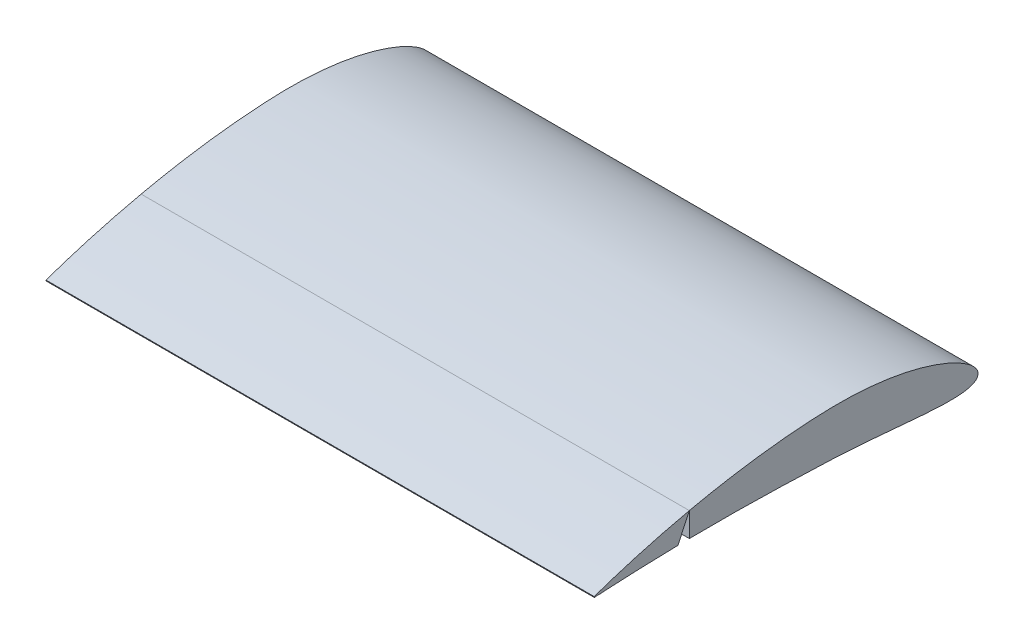
ISO-10303-21;
HEADER;
FILE_DESCRIPTION(('STEP AP214'),'2;1');
FILE_NAME('part.step','',(''),(''),'','','');
FILE_SCHEMA(('AUTOMOTIVE_DESIGN { 1 0 10303 214 1 1 1 1 }'));
ENDSEC;
DATA;
#1=APPLICATION_CONTEXT('core data for automotive mechanical design processes');
#2=APPLICATION_PROTOCOL_DEFINITION('international standard','automotive_design',2000,#1);
#3=PRODUCT_CONTEXT('',#1,'mechanical');
#4=PRODUCT('Part','Part','',(#3));
#5=PRODUCT_RELATED_PRODUCT_CATEGORY('part','',(#4));
#6=PRODUCT_DEFINITION_FORMATION('','',#4);
#7=PRODUCT_DEFINITION_CONTEXT('part definition',#1,'design');
#8=PRODUCT_DEFINITION('design','',#6,#7);
#9=PRODUCT_DEFINITION_SHAPE('','',#8);
#10=(LENGTH_UNIT() NAMED_UNIT(*) SI_UNIT(.MILLI.,.METRE.));
#11=(NAMED_UNIT(*) PLANE_ANGLE_UNIT() SI_UNIT($,.RADIAN.));
#12=(NAMED_UNIT(*) SI_UNIT($,.STERADIAN.) SOLID_ANGLE_UNIT());
#13=UNCERTAINTY_MEASURE_WITH_UNIT(LENGTH_MEASURE(1.E-05),#10,'distance_accuracy_value','');
#14=(GEOMETRIC_REPRESENTATION_CONTEXT(3) GLOBAL_UNCERTAINTY_ASSIGNED_CONTEXT((#13)) GLOBAL_UNIT_ASSIGNED_CONTEXT((#10,
#11,#12)) REPRESENTATION_CONTEXT('',''));
#15=CARTESIAN_POINT('',(0.,0.,0.));
#16=DIRECTION('',(0.,0.,1.));
#17=DIRECTION('',(1.,0.,0.));
#18=AXIS2_PLACEMENT_3D('',#15,#16,#17);
#19=CARTESIAN_POINT('',(-254.,-0.0302571964763549,354.787327227915));
#20=CARTESIAN_POINT('',(-254.,-0.202511549774369,354.777220058735));
#21=CARTESIAN_POINT('',(-254.,-0.758116619532224,354.744619463571));
#22=CARTESIAN_POINT('',(-254.,-0.0353878265544988,352.780150329408));
#23=CARTESIAN_POINT('',(-254.,-0.406394891328532,350.227621537646));
#24=CARTESIAN_POINT('',(-254.,0.191518705423128,345.076973542852));
#25=CARTESIAN_POINT('',(-254.,0.426846954997304,338.388880463138));
#26=CARTESIAN_POINT('',(-254.,0.912902226587254,329.767358245601));
#27=CARTESIAN_POINT('',(-254.,1.37107480853054,319.513378005819));
#28=CARTESIAN_POINT('',(-254.,1.85212662662604,307.681856469284));
#29=CARTESIAN_POINT('',(-254.,2.2828903737653,294.437996631764));
#30=CARTESIAN_POINT('',(-254.,2.65636592644588,279.933149694368));
#31=CARTESIAN_POINT('',(-254.,2.90744759821903,264.337268620967));
#32=CARTESIAN_POINT('',(-254.,3.02848065946825,247.830237404837));
#33=CARTESIAN_POINT('',(-254.,2.97910623211237,224.541124113717));
#34=CARTESIAN_POINT('',(-254.,2.58624656268472,200.671973719441));
#35=CARTESIAN_POINT('',(-254.,1.91789319340299,176.483884619505));
#36=CARTESIAN_POINT('',(-254.,1.28674404323604,158.296467958687));
#37=CARTESIAN_POINT('',(-254.,0.674535202653767,140.48477689744));
#38=CARTESIAN_POINT('',(-254.,-0.458414507964394,117.937239158073));
#39=CARTESIAN_POINT('',(-254.,-2.15355585803942,96.4067365521407));
#40=CARTESIAN_POINT('',(-254.,-3.98391169785236,75.9298626432168));
#41=CARTESIAN_POINT('',(-254.,-5.23803481691952,61.9523939500743));
#42=CARTESIAN_POINT('',(-254.,-6.3018667845873,49.0830780174977));
#43=CARTESIAN_POINT('',(-254.,-7.05379709208437,37.4470572233417));
#44=CARTESIAN_POINT('',(-254.,-7.40487495085787,27.1638266260831));
#45=CARTESIAN_POINT('',(-254.,-7.26852765592077,18.3491197902741));
#46=CARTESIAN_POINT('',(-254.,-6.58746462442697,11.0873159681167));
#47=CARTESIAN_POINT('',(-254.,-5.28808573883758,5.4507808849597));
#48=CARTESIAN_POINT('',(-254.,-3.30894318563573,1.35108725963543));
#49=CARTESIAN_POINT('',(-254.,-0.148325215865237,-0.987487677240321));
#50=CARTESIAN_POINT('',(-254.,3.7967578133831,-0.765838064798878));
#51=CARTESIAN_POINT('',(-254.,7.71649979382027,1.67922407257184));
#52=CARTESIAN_POINT('',(-254.,11.8553419578337,5.92689766090299));
#53=CARTESIAN_POINT('',(-254.,16.2262899348965,12.1072031542234));
#54=CARTESIAN_POINT('',(-254.,20.7343193498453,20.187014187513));
#55=CARTESIAN_POINT('',(-254.,25.2201252971746,30.130463623116));
#56=CARTESIAN_POINT('',(-254.,29.5108543834638,41.8433907768923));
#57=CARTESIAN_POINT('',(-254.,33.4329059974258,55.1997604360673));
#58=CARTESIAN_POINT('',(-254.,36.8104805743368,70.0434509571498));
#59=CARTESIAN_POINT('',(-254.,39.4786761807971,86.1884085277303));
#60=CARTESIAN_POINT('',(-254.,41.32105063238,103.42216726238));
#61=CARTESIAN_POINT('',(-254.,42.2288581946823,121.516747473044));
#62=CARTESIAN_POINT('',(-254.,42.1113766684293,140.09669102153));
#63=CARTESIAN_POINT('',(-254.,41.1132128906756,158.902335219002));
#64=CARTESIAN_POINT('',(-254.,39.0904540579609,183.961657870227));
#65=CARTESIAN_POINT('',(-254.,36.0047557168601,208.774809212926));
#66=CARTESIAN_POINT('',(-254.,31.1455287976255,238.622276389231));
#67=CARTESIAN_POINT('',(-254.,26.6515697314507,261.175777938493));
#68=CARTESIAN_POINT('',(-254.,21.7242725259394,282.422876263721));
#69=CARTESIAN_POINT('',(-254.,17.1306006385399,300.598349456261));
#70=CARTESIAN_POINT('',(-254.,11.7988919274353,319.654473711953));
#71=CARTESIAN_POINT('',(-254.,6.72155114802005,336.024074691811));
#72=CARTESIAN_POINT('',(-254.,3.49779827393597,345.800950265157));
#73=CARTESIAN_POINT('',(-254.,1.92709586834348,350.478726649503));
#74=CARTESIAN_POINT('',(-254.,0.953557869568799,353.29965963041));
#75=CARTESIAN_POINT('',(-254.,0.519388000117919,354.559877308969));
#76=CARTESIAN_POINT('',(-254.,0.410417886541196,354.876173010782));
#77=B_SPLINE_CURVE_WITH_KNOTS('',3,(#19,#20,#21,#22,#23,#24,#25,#26,#27,#28,#29,#30,#31,#32,#33,
#34,#35,#36,#37,#38,#39,#40,#41,#42,#43,#44,#45,#46,#47,#48,#49,#50,#51,#52,#53,#54,#55,#56,#57,
#58,#59,#60,#61,#62,#63,#64,#65,#66,#67,#68,#69,#70,#71,#72,#73,#74,#75,#76),.UNSPECIFIED.,.F.,
.F.,(4,1,1,1,1,1,1,1,1,1,1,1,1,1,1,1,1,1,1,1,1,1,1,1,1,1,1,1,1,1,1,1,1,1,1,1,1,1,1,1,1,1,1,1,1,
1,1,1,1,1,1,1,1,1,1,4),(0.,0.00061435602735338,0.00198160056276364,0.00606849911990259,
0.0128259983002053,0.0221600600259541,0.0339528411484215,0.0480573219049674,0.0643016527838605,
0.0824806064748046,0.102390013464696,0.123786894847983,0.146429707819126,0.170067604158041,
0.219268231220122,0.244299756437978,0.269272617042279,0.293879334559277,0.317367886846568,
0.361825599196296,0.382415541627446,0.401655123624231,0.419361860817184,0.435356743556399,
0.44945739068769,0.461534248286615,0.471483960270294,0.479298491667603,0.485175806315722,
0.489815015537041,0.49445371882196,0.500384211459872,0.508369297965653,0.518670584727767,
0.531320006060474,0.54625561026072,0.563345994084458,0.58242326585592,0.60328874622392,
0.625720296766354,0.649474912467889,0.674310012117921,0.699958821683972,0.725614899189679,
0.751503233324799,0.803021620411888,0.828087427427487,0.875472920842336,0.897280851310736,
0.917503738861992,0.952328750245583,0.978398030734231,0.987765198149775,0.994535224157492,
0.998628423374974,1.),.UNSPECIFIED.);
#78=DIRECTION('',(1.,0.,0.));
#79=VECTOR('',#78,1.);
#80=SURFACE_OF_LINEAR_EXTRUSION('',#77,#79);
#81=DIRECTION('',(1.,0.,0.));
#82=VECTOR('',#81,1.);
#83=CARTESIAN_POINT('',(-254.,2.68576626150921,277.250314183645));
#84=LINE('',#83,#82);
#85=CARTESIAN_POINT('',(-254.,2.6857662610756,277.250314183847));
#86=VERTEX_POINT('',#85);
#87=CARTESIAN_POINT('',(254.,2.68576626107558,277.250314183847));
#88=VERTEX_POINT('',#87);
#89=EDGE_CURVE('E68',#86,#88,#84,.T.);
#90=ORIENTED_EDGE('',*,*,#89,.T.);
#91=CARTESIAN_POINT('',(254.,-0.0302571964763549,354.787327227915));
#92=CARTESIAN_POINT('',(254.,-0.202511549774369,354.777220058735));
#93=CARTESIAN_POINT('',(254.,-0.758116619532224,354.744619463571));
#94=CARTESIAN_POINT('',(254.,-0.0353878265544988,352.780150329408));
#95=CARTESIAN_POINT('',(254.,-0.406394891328532,350.227621537646));
#96=CARTESIAN_POINT('',(254.,0.191518705423128,345.076973542852));
#97=CARTESIAN_POINT('',(254.,0.426846954997304,338.388880463138));
#98=CARTESIAN_POINT('',(254.,0.912902226587254,329.767358245601));
#99=CARTESIAN_POINT('',(254.,1.37107480853054,319.513378005819));
#100=CARTESIAN_POINT('',(254.,1.85212662662604,307.681856469284));
#101=CARTESIAN_POINT('',(254.,2.2828903737653,294.437996631764));
#102=CARTESIAN_POINT('',(254.,2.65636592644588,279.933149694368));
#103=CARTESIAN_POINT('',(254.,2.90744759821903,264.337268620967));
#104=CARTESIAN_POINT('',(254.,3.02848065946825,247.830237404837));
#105=CARTESIAN_POINT('',(254.,2.97910623211237,224.541124113717));
#106=CARTESIAN_POINT('',(254.,2.58624656268472,200.671973719441));
#107=CARTESIAN_POINT('',(254.,1.91789319340299,176.483884619505));
#108=CARTESIAN_POINT('',(254.,1.28674404323604,158.296467958687));
#109=CARTESIAN_POINT('',(254.,0.674535202653767,140.48477689744));
#110=CARTESIAN_POINT('',(254.,-0.458414507964394,117.937239158073));
#111=CARTESIAN_POINT('',(254.,-2.15355585803942,96.4067365521407));
#112=CARTESIAN_POINT('',(254.,-3.98391169785236,75.9298626432168));
#113=CARTESIAN_POINT('',(254.,-5.23803481691952,61.9523939500743));
#114=CARTESIAN_POINT('',(254.,-6.3018667845873,49.0830780174977));
#115=CARTESIAN_POINT('',(254.,-7.05379709208437,37.4470572233417));
#116=CARTESIAN_POINT('',(254.,-7.40487495085787,27.1638266260831));
#117=CARTESIAN_POINT('',(254.,-7.26852765592077,18.3491197902741));
#118=CARTESIAN_POINT('',(254.,-6.58746462442697,11.0873159681167));
#119=CARTESIAN_POINT('',(254.,-5.28808573883758,5.4507808849597));
#120=CARTESIAN_POINT('',(254.,-3.30894318563573,1.35108725963543));
#121=CARTESIAN_POINT('',(254.,-0.148325215865237,-0.987487677240321));
#122=CARTESIAN_POINT('',(254.,3.7967578133831,-0.765838064798878));
#123=CARTESIAN_POINT('',(254.,7.71649979382027,1.67922407257184));
#124=CARTESIAN_POINT('',(254.,11.8553419578337,5.92689766090299));
#125=CARTESIAN_POINT('',(254.,16.2262899348965,12.1072031542234));
#126=CARTESIAN_POINT('',(254.,20.7343193498453,20.187014187513));
#127=CARTESIAN_POINT('',(254.,25.2201252971746,30.130463623116));
#128=CARTESIAN_POINT('',(254.,29.5108543834638,41.8433907768923));
#129=CARTESIAN_POINT('',(254.,33.4329059974258,55.1997604360673));
#130=CARTESIAN_POINT('',(254.,36.8104805743368,70.0434509571498));
#131=CARTESIAN_POINT('',(254.,39.4786761807971,86.1884085277303));
#132=CARTESIAN_POINT('',(254.,41.32105063238,103.42216726238));
#133=CARTESIAN_POINT('',(254.,42.2288581946823,121.516747473044));
#134=CARTESIAN_POINT('',(254.,42.1113766684293,140.09669102153));
#135=CARTESIAN_POINT('',(254.,41.1132128906756,158.902335219002));
#136=CARTESIAN_POINT('',(254.,39.0904540579609,183.961657870227));
#137=CARTESIAN_POINT('',(254.,36.0047557168601,208.774809212926));
#138=CARTESIAN_POINT('',(254.,31.1455287976255,238.622276389231));
#139=CARTESIAN_POINT('',(254.,26.6515697314507,261.175777938493));
#140=CARTESIAN_POINT('',(254.,21.7242725259394,282.422876263721));
#141=CARTESIAN_POINT('',(254.,17.1306006385399,300.598349456261));
#142=CARTESIAN_POINT('',(254.,11.7988919274353,319.654473711953));
#143=CARTESIAN_POINT('',(254.,6.72155114802005,336.024074691811));
#144=CARTESIAN_POINT('',(254.,3.49779827393597,345.800950265157));
#145=CARTESIAN_POINT('',(254.,1.92709586834348,350.478726649503));
#146=CARTESIAN_POINT('',(254.,0.953557869568799,353.29965963041));
#147=CARTESIAN_POINT('',(254.,0.519388000117919,354.559877308969));
#148=CARTESIAN_POINT('',(254.,0.410417886541196,354.876173010782));
#149=B_SPLINE_CURVE_WITH_KNOTS('',3,(#91,#92,#93,#94,#95,#96,#97,#98,#99,#100,#101,#102,#103,
#104,#105,#106,#107,#108,#109,#110,#111,#112,#113,#114,#115,#116,#117,#118,#119,#120,#121,#122,
#123,#124,#125,#126,#127,#128,#129,#130,#131,#132,#133,#134,#135,#136,#137,#138,#139,#140,#141,
#142,#143,#144,#145,#146,#147,#148),.UNSPECIFIED.,.F.,.F.,(4,1,1,1,1,1,1,1,1,1,1,1,1,1,1,1,1,1,
1,1,1,1,1,1,1,1,1,1,1,1,1,1,1,1,1,1,1,1,1,1,1,1,1,1,1,1,1,1,1,1,1,1,1,1,1,4),(0.,
0.00061435602735338,0.00198160056276364,0.00606849911990259,0.0128259983002053,
0.0221600600259541,0.0339528411484215,0.0480573219049674,0.0643016527838605,0.0824806064748046,
0.102390013464696,0.123786894847983,0.146429707819126,0.170067604158041,0.219268231220122,
0.244299756437978,0.269272617042279,0.293879334559277,0.317367886846568,0.361825599196296,
0.382415541627446,0.401655123624231,0.419361860817184,0.435356743556399,0.44945739068769,
0.461534248286615,0.471483960270294,0.479298491667603,0.485175806315722,0.489815015537041,
0.49445371882196,0.500384211459872,0.508369297965653,0.518670584727767,0.531320006060474,
0.54625561026072,0.563345994084458,0.58242326585592,0.60328874622392,0.625720296766354,
0.649474912467889,0.674310012117921,0.699958821683972,0.725614899189679,0.751503233324799,
0.803021620411888,0.828087427427487,0.875472920842336,0.897280851310736,0.917503738861992,
0.952328750245583,0.978398030734231,0.987765198149775,0.994535224157492,0.998628423374974,1.),.UNSPECIFIED.);
#150=CARTESIAN_POINT('',(254.,-0.030257196476355,354.787327227915));
#151=VERTEX_POINT('',#150);
#152=EDGE_CURVE('E54',#151,#88,#149,.T.);
#153=ORIENTED_EDGE('',*,*,#152,.F.);
#154=DIRECTION('',(1.,0.,0.));
#155=VECTOR('',#154,1.);
#156=CARTESIAN_POINT('',(-254.,-0.030257196476355,354.787327227915));
#157=LINE('',#156,#155);
#158=CARTESIAN_POINT('',(-254.,-0.030257196476355,354.787327227915));
#159=VERTEX_POINT('',#158);
#160=EDGE_CURVE('E121',#159,#151,#157,.T.);
#161=ORIENTED_EDGE('',*,*,#160,.F.);
#162=EDGE_CURVE('E103',#159,#86,#77,.T.);
#163=ORIENTED_EDGE('',*,*,#162,.T.);
#164=EDGE_LOOP('',(#90,#153,#161,#163));
#165=FACE_BOUND('',#164,.T.);
#166=ADVANCED_FACE('F50',(#165),#80,.T.);
#167=CARTESIAN_POINT('',(254.,25.3109880456868,266.699999982787));
#168=VERTEX_POINT('',#167);
#169=CARTESIAN_POINT('',(254.,0.410417886541196,354.876173010782));
#170=VERTEX_POINT('',#169);
#171=EDGE_CURVE('E101',#168,#170,#149,.T.);
#172=ORIENTED_EDGE('',*,*,#171,.F.);
#173=DIRECTION('',(-1.,0.,0.));
#174=VECTOR('',#173,1.);
#175=CARTESIAN_POINT('',(254.001,25.3109880418854,266.7));
#176=LINE('',#175,#174);
#177=CARTESIAN_POINT('',(-254.,25.3109880418854,266.7));
#178=VERTEX_POINT('',#177);
#179=EDGE_CURVE('E87',#168,#178,#176,.T.);
#180=ORIENTED_EDGE('',*,*,#179,.T.);
#181=CARTESIAN_POINT('',(-254.,0.410417886541196,354.876173010782));
#182=VERTEX_POINT('',#181);
#183=EDGE_CURVE('E99',#178,#182,#77,.T.);
#184=ORIENTED_EDGE('',*,*,#183,.T.);
#185=DIRECTION('',(1.,0.,0.));
#186=VECTOR('',#185,1.);
#187=CARTESIAN_POINT('',(-254.,0.410417886541196,354.876173010782));
#188=LINE('',#187,#186);
#189=EDGE_CURVE('E108',#182,#170,#188,.T.);
#190=ORIENTED_EDGE('',*,*,#189,.T.);
#191=EDGE_LOOP('',(#172,#180,#184,#190));
#192=FACE_BOUND('',#191,.T.);
#193=ADVANCED_FACE('F97',(#192),#80,.T.);
#194=CARTESIAN_POINT('',(-254.,6.95548452892668,1.34686834904547));
#195=DIRECTION('',(-1.,0.,0.));
#196=DIRECTION('',(0.,0.,1.));
#197=AXIS2_PLACEMENT_3D('',#194,#195,#196);
#198=PLANE('',#197);
#199=DIRECTION('',(0.,0.906307787036649,-0.422618261740701));
#200=VECTOR('',#199,1.);
#201=CARTESIAN_POINT('',(-254.,25.3109880418854,266.7));
#202=LINE('',#201,#200);
#203=EDGE_CURVE('E61',#86,#178,#202,.T.);
#204=ORIENTED_EDGE('',*,*,#203,.F.);
#205=ORIENTED_EDGE('',*,*,#162,.F.);
#206=DIRECTION('',(0.,-0.980275441523261,-0.197636177726589));
#207=VECTOR('',#206,1.);
#208=CARTESIAN_POINT('',(-254.,-0.030257196476355,354.787327227915));
#209=LINE('',#208,#207);
#210=EDGE_CURVE('E94',#182,#159,#209,.T.);
#211=ORIENTED_EDGE('',*,*,#210,.F.);
#212=ORIENTED_EDGE('',*,*,#183,.F.);
#213=EDGE_LOOP('',(#204,#205,#211,#212));
#214=FACE_BOUND('',#213,.T.);
#215=ADVANCED_FACE('F106',(#214),#198,.T.);
#216=CARTESIAN_POINT('',(254.,6.95548452892668,1.34686834904547));
#217=DIRECTION('',(-1.,0.,0.));
#218=DIRECTION('',(0.,0.,1.));
#219=AXIS2_PLACEMENT_3D('',#216,#217,#218);
#220=PLANE('',#219);
#221=ORIENTED_EDGE('',*,*,#152,.T.);
#222=DIRECTION('',(0.,-0.906307787036649,0.422618261740702));
#223=VECTOR('',#222,1.);
#224=CARTESIAN_POINT('',(254.,25.3109880418854,266.7));
#225=LINE('',#224,#223);
#226=EDGE_CURVE('E12',#168,#88,#225,.T.);
#227=ORIENTED_EDGE('',*,*,#226,.F.);
#228=ORIENTED_EDGE('',*,*,#171,.T.);
#229=DIRECTION('',(0.,-0.980275441523261,-0.197636177726589));
#230=VECTOR('',#229,1.);
#231=CARTESIAN_POINT('',(254.,-0.030257196476355,354.787327227915));
#232=LINE('',#231,#230);
#233=EDGE_CURVE('E118',#170,#151,#232,.T.);
#234=ORIENTED_EDGE('',*,*,#233,.T.);
#235=EDGE_LOOP('',(#221,#227,#228,#234));
#236=FACE_BOUND('',#235,.T.);
#237=ADVANCED_FACE('F127',(#236),#220,.F.);
#238=CARTESIAN_POINT('',(-254.,-0.030257196476355,354.787327227915));
#239=DIRECTION('',(0.,-0.197636177726589,0.980275441523261));
#240=DIRECTION('',(0.,-0.980275441523261,-0.197636177726589));
#241=AXIS2_PLACEMENT_3D('',#238,#239,#240);
#242=PLANE('',#241);
#243=ORIENTED_EDGE('',*,*,#160,.T.);
#244=ORIENTED_EDGE('',*,*,#233,.F.);
#245=ORIENTED_EDGE('',*,*,#189,.F.);
#246=ORIENTED_EDGE('',*,*,#210,.T.);
#247=EDGE_LOOP('',(#243,#244,#245,#246));
#248=FACE_BOUND('',#247,.T.);
#249=ADVANCED_FACE('F125',(#248),#242,.T.);
#250=CARTESIAN_POINT('',(254.001,25.3109880418854,266.7));
#251=DIRECTION('',(0.,0.422618261740701,0.906307787036649));
#252=DIRECTION('',(0.,-0.906307787036649,0.422618261740702));
#253=AXIS2_PLACEMENT_3D('',#250,#251,#252);
#254=PLANE('',#253);
#255=ORIENTED_EDGE('',*,*,#203,.T.);
#256=ORIENTED_EDGE('',*,*,#179,.F.);
#257=ORIENTED_EDGE('',*,*,#226,.T.);
#258=ORIENTED_EDGE('',*,*,#89,.F.);
#259=EDGE_LOOP('',(#255,#256,#257,#258));
#260=FACE_BOUND('',#259,.T.);
#261=ADVANCED_FACE('F89',(#260),#254,.F.);
#262=CLOSED_SHELL('',(#166,#193,#215,#237,#249,#261));
#263=MANIFOLD_SOLID_BREP('B2',#262);
#264=CARTESIAN_POINT('',(254.,6.95548452892668,1.34686834904547));
#265=DIRECTION('',(-1.,0.,0.));
#266=DIRECTION('',(0.,0.,1.));
#267=AXIS2_PLACEMENT_3D('',#264,#265,#266);
#268=PLANE('',#267);
#269=CARTESIAN_POINT('',(254.,-0.0302571964763549,354.787327227915));
#270=CARTESIAN_POINT('',(254.,-0.202511549774369,354.777220058735));
#271=CARTESIAN_POINT('',(254.,-0.758116619532224,354.744619463571));
#272=CARTESIAN_POINT('',(254.,-0.0353878265544988,352.780150329408));
#273=CARTESIAN_POINT('',(254.,-0.406394891328532,350.227621537646));
#274=CARTESIAN_POINT('',(254.,0.191518705423128,345.076973542852));
#275=CARTESIAN_POINT('',(254.,0.426846954997304,338.388880463138));
#276=CARTESIAN_POINT('',(254.,0.912902226587254,329.767358245601));
#277=CARTESIAN_POINT('',(254.,1.37107480853054,319.513378005819));
#278=CARTESIAN_POINT('',(254.,1.85212662662604,307.681856469284));
#279=CARTESIAN_POINT('',(254.,2.2828903737653,294.437996631764));
#280=CARTESIAN_POINT('',(254.,2.65636592644588,279.933149694368));
#281=CARTESIAN_POINT('',(254.,2.90744759821903,264.337268620967));
#282=CARTESIAN_POINT('',(254.,3.02848065946825,247.830237404837));
#283=CARTESIAN_POINT('',(254.,2.97910623211237,224.541124113717));
#284=CARTESIAN_POINT('',(254.,2.58624656268472,200.671973719441));
#285=CARTESIAN_POINT('',(254.,1.91789319340299,176.483884619505));
#286=CARTESIAN_POINT('',(254.,1.28674404323604,158.296467958687));
#287=CARTESIAN_POINT('',(254.,0.674535202653767,140.48477689744));
#288=CARTESIAN_POINT('',(254.,-0.458414507964394,117.937239158073));
#289=CARTESIAN_POINT('',(254.,-2.15355585803942,96.4067365521407));
#290=CARTESIAN_POINT('',(254.,-3.98391169785236,75.9298626432168));
#291=CARTESIAN_POINT('',(254.,-5.23803481691952,61.9523939500743));
#292=CARTESIAN_POINT('',(254.,-6.3018667845873,49.0830780174977));
#293=CARTESIAN_POINT('',(254.,-7.05379709208437,37.4470572233417));
#294=CARTESIAN_POINT('',(254.,-7.40487495085787,27.1638266260831));
#295=CARTESIAN_POINT('',(254.,-7.26852765592077,18.3491197902741));
#296=CARTESIAN_POINT('',(254.,-6.58746462442697,11.0873159681167));
#297=CARTESIAN_POINT('',(254.,-5.28808573883758,5.4507808849597));
#298=CARTESIAN_POINT('',(254.,-3.30894318563573,1.35108725963543));
#299=CARTESIAN_POINT('',(254.,-0.148325215865237,-0.987487677240321));
#300=CARTESIAN_POINT('',(254.,3.7967578133831,-0.765838064798878));
#301=CARTESIAN_POINT('',(254.,7.71649979382027,1.67922407257184));
#302=CARTESIAN_POINT('',(254.,11.8553419578337,5.92689766090299));
#303=CARTESIAN_POINT('',(254.,16.2262899348965,12.1072031542234));
#304=CARTESIAN_POINT('',(254.,20.7343193498453,20.187014187513));
#305=CARTESIAN_POINT('',(254.,25.2201252971746,30.130463623116));
#306=CARTESIAN_POINT('',(254.,29.5108543834638,41.8433907768923));
#307=CARTESIAN_POINT('',(254.,33.4329059974258,55.1997604360673));
#308=CARTESIAN_POINT('',(254.,36.8104805743368,70.0434509571498));
#309=CARTESIAN_POINT('',(254.,39.4786761807971,86.1884085277303));
#310=CARTESIAN_POINT('',(254.,41.32105063238,103.42216726238));
#311=CARTESIAN_POINT('',(254.,42.2288581946823,121.516747473044));
#312=CARTESIAN_POINT('',(254.,42.1113766684293,140.09669102153));
#313=CARTESIAN_POINT('',(254.,41.1132128906756,158.902335219002));
#314=CARTESIAN_POINT('',(254.,39.0904540579609,183.961657870227));
#315=CARTESIAN_POINT('',(254.,36.0047557168601,208.774809212926));
#316=CARTESIAN_POINT('',(254.,31.1455287976255,238.622276389231));
#317=CARTESIAN_POINT('',(254.,26.6515697314507,261.175777938493));
#318=CARTESIAN_POINT('',(254.,21.7242725259394,282.422876263721));
#319=CARTESIAN_POINT('',(254.,17.1306006385399,300.598349456261));
#320=CARTESIAN_POINT('',(254.,11.7988919274353,319.654473711953));
#321=CARTESIAN_POINT('',(254.,6.72155114802005,336.024074691811));
#322=CARTESIAN_POINT('',(254.,3.49779827393597,345.800950265157));
#323=CARTESIAN_POINT('',(254.,1.92709586834348,350.478726649503));
#324=CARTESIAN_POINT('',(254.,0.953557869568799,353.29965963041));
#325=CARTESIAN_POINT('',(254.,0.519388000117919,354.559877308969));
#326=CARTESIAN_POINT('',(254.,0.410417886541196,354.876173010782));
#327=B_SPLINE_CURVE_WITH_KNOTS('',3,(#269,#270,#271,#272,#273,#274,#275,#276,#277,#278,#279,
#280,#281,#282,#283,#284,#285,#286,#287,#288,#289,#290,#291,#292,#293,#294,#295,#296,#297,#298,
#299,#300,#301,#302,#303,#304,#305,#306,#307,#308,#309,#310,#311,#312,#313,#314,#315,#316,#317,
#318,#319,#320,#321,#322,#323,#324,#325,#326),.UNSPECIFIED.,.F.,.F.,(4,1,1,1,1,1,1,1,1,1,1,1,1,
1,1,1,1,1,1,1,1,1,1,1,1,1,1,1,1,1,1,1,1,1,1,1,1,1,1,1,1,1,1,1,1,1,1,1,1,1,1,1,1,1,1,4),(0.,
0.00061435602735338,0.00198160056276364,0.00606849911990259,0.0128259983002053,
0.0221600600259541,0.0339528411484215,0.0480573219049674,0.0643016527838605,0.0824806064748046,
0.102390013464696,0.123786894847983,0.146429707819126,0.170067604158041,0.219268231220122,
0.244299756437978,0.269272617042279,0.293879334559277,0.317367886846568,0.361825599196296,
0.382415541627446,0.401655123624231,0.419361860817184,0.435356743556399,0.44945739068769,
0.461534248286615,0.471483960270294,0.479298491667603,0.485175806315722,0.489815015537041,
0.49445371882196,0.500384211459872,0.508369297965653,0.518670584727767,0.531320006060474,
0.54625561026072,0.563345994084458,0.58242326585592,0.60328874622392,0.625720296766354,
0.649474912467889,0.674310012117921,0.699958821683972,0.725614899189679,0.751503233324799,
0.803021620411888,0.828087427427487,0.875472920842336,0.897280851310736,0.917503738861992,
0.952328750245583,0.978398030734231,0.987765198149775,0.994535224157492,0.998628423374974,1.),.UNSPECIFIED.);
#328=CARTESIAN_POINT('',(254.,2.85478886450617,266.699999999999));
#329=VERTEX_POINT('',#328);
#330=CARTESIAN_POINT('',(254.,25.3109880418854,266.7));
#331=VERTEX_POINT('',#330);
#332=EDGE_CURVE('E220',#329,#331,#327,.T.);
#333=ORIENTED_EDGE('',*,*,#332,.T.);
#334=DIRECTION('',(0.,1.,0.));
#335=VECTOR('',#334,1.);
#336=CARTESIAN_POINT('',(254.,25.3109880418854,266.7));
#337=LINE('',#336,#335);
#338=EDGE_CURVE('E215',#329,#331,#337,.T.);
#339=ORIENTED_EDGE('',*,*,#338,.F.);
#340=EDGE_LOOP('',(#333,#339));
#341=FACE_BOUND('',#340,.T.);
#342=ADVANCED_FACE('F185',(#341),#268,.F.);
#343=CARTESIAN_POINT('',(-254.,6.95548452892668,1.34686834904547));
#344=DIRECTION('',(-1.,0.,0.));
#345=DIRECTION('',(0.,0.,1.));
#346=AXIS2_PLACEMENT_3D('',#343,#344,#345);
#347=PLANE('',#346);
#348=DIRECTION('',(0.,-1.,0.));
#349=VECTOR('',#348,1.);
#350=CARTESIAN_POINT('',(-254.,25.3109880418854,266.7));
#351=LINE('',#350,#349);
#352=CARTESIAN_POINT('',(-254.,25.3109880418854,266.7));
#353=VERTEX_POINT('',#352);
#354=CARTESIAN_POINT('',(-254.,2.85478886450617,266.699999999999));
#355=VERTEX_POINT('',#354);
#356=EDGE_CURVE('E210',#353,#355,#351,.T.);
#357=ORIENTED_EDGE('',*,*,#356,.F.);
#358=CARTESIAN_POINT('',(-254.,-0.0302571964763549,354.787327227915));
#359=CARTESIAN_POINT('',(-254.,-0.202511549774369,354.777220058735));
#360=CARTESIAN_POINT('',(-254.,-0.758116619532224,354.744619463571));
#361=CARTESIAN_POINT('',(-254.,-0.0353878265544988,352.780150329408));
#362=CARTESIAN_POINT('',(-254.,-0.406394891328532,350.227621537646));
#363=CARTESIAN_POINT('',(-254.,0.191518705423128,345.076973542852));
#364=CARTESIAN_POINT('',(-254.,0.426846954997304,338.388880463138));
#365=CARTESIAN_POINT('',(-254.,0.912902226587254,329.767358245601));
#366=CARTESIAN_POINT('',(-254.,1.37107480853054,319.513378005819));
#367=CARTESIAN_POINT('',(-254.,1.85212662662604,307.681856469284));
#368=CARTESIAN_POINT('',(-254.,2.2828903737653,294.437996631764));
#369=CARTESIAN_POINT('',(-254.,2.65636592644588,279.933149694368));
#370=CARTESIAN_POINT('',(-254.,2.90744759821903,264.337268620967));
#371=CARTESIAN_POINT('',(-254.,3.02848065946825,247.830237404837));
#372=CARTESIAN_POINT('',(-254.,2.97910623211237,224.541124113717));
#373=CARTESIAN_POINT('',(-254.,2.58624656268472,200.671973719441));
#374=CARTESIAN_POINT('',(-254.,1.91789319340299,176.483884619505));
#375=CARTESIAN_POINT('',(-254.,1.28674404323604,158.296467958687));
#376=CARTESIAN_POINT('',(-254.,0.674535202653767,140.48477689744));
#377=CARTESIAN_POINT('',(-254.,-0.458414507964394,117.937239158073));
#378=CARTESIAN_POINT('',(-254.,-2.15355585803942,96.4067365521407));
#379=CARTESIAN_POINT('',(-254.,-3.98391169785236,75.9298626432168));
#380=CARTESIAN_POINT('',(-254.,-5.23803481691952,61.9523939500743));
#381=CARTESIAN_POINT('',(-254.,-6.3018667845873,49.0830780174977));
#382=CARTESIAN_POINT('',(-254.,-7.05379709208437,37.4470572233417));
#383=CARTESIAN_POINT('',(-254.,-7.40487495085787,27.1638266260831));
#384=CARTESIAN_POINT('',(-254.,-7.26852765592077,18.3491197902741));
#385=CARTESIAN_POINT('',(-254.,-6.58746462442697,11.0873159681167));
#386=CARTESIAN_POINT('',(-254.,-5.28808573883758,5.4507808849597));
#387=CARTESIAN_POINT('',(-254.,-3.30894318563573,1.35108725963543));
#388=CARTESIAN_POINT('',(-254.,-0.148325215865237,-0.987487677240321));
#389=CARTESIAN_POINT('',(-254.,3.7967578133831,-0.765838064798878));
#390=CARTESIAN_POINT('',(-254.,7.71649979382027,1.67922407257184));
#391=CARTESIAN_POINT('',(-254.,11.8553419578337,5.92689766090299));
#392=CARTESIAN_POINT('',(-254.,16.2262899348965,12.1072031542234));
#393=CARTESIAN_POINT('',(-254.,20.7343193498453,20.187014187513));
#394=CARTESIAN_POINT('',(-254.,25.2201252971746,30.130463623116));
#395=CARTESIAN_POINT('',(-254.,29.5108543834638,41.8433907768923));
#396=CARTESIAN_POINT('',(-254.,33.4329059974258,55.1997604360673));
#397=CARTESIAN_POINT('',(-254.,36.8104805743368,70.0434509571498));
#398=CARTESIAN_POINT('',(-254.,39.4786761807971,86.1884085277303));
#399=CARTESIAN_POINT('',(-254.,41.32105063238,103.42216726238));
#400=CARTESIAN_POINT('',(-254.,42.2288581946823,121.516747473044));
#401=CARTESIAN_POINT('',(-254.,42.1113766684293,140.09669102153));
#402=CARTESIAN_POINT('',(-254.,41.1132128906756,158.902335219002));
#403=CARTESIAN_POINT('',(-254.,39.0904540579609,183.961657870227));
#404=CARTESIAN_POINT('',(-254.,36.0047557168601,208.774809212926));
#405=CARTESIAN_POINT('',(-254.,31.1455287976255,238.622276389231));
#406=CARTESIAN_POINT('',(-254.,26.6515697314507,261.175777938493));
#407=CARTESIAN_POINT('',(-254.,21.7242725259394,282.422876263721));
#408=CARTESIAN_POINT('',(-254.,17.1306006385399,300.598349456261));
#409=CARTESIAN_POINT('',(-254.,11.7988919274353,319.654473711953));
#410=CARTESIAN_POINT('',(-254.,6.72155114802005,336.024074691811));
#411=CARTESIAN_POINT('',(-254.,3.49779827393597,345.800950265157));
#412=CARTESIAN_POINT('',(-254.,1.92709586834348,350.478726649503));
#413=CARTESIAN_POINT('',(-254.,0.953557869568799,353.29965963041));
#414=CARTESIAN_POINT('',(-254.,0.519388000117919,354.559877308969));
#415=CARTESIAN_POINT('',(-254.,0.410417886541196,354.876173010782));
#416=B_SPLINE_CURVE_WITH_KNOTS('',3,(#358,#359,#360,#361,#362,#363,#364,#365,#366,#367,#368,
#369,#370,#371,#372,#373,#374,#375,#376,#377,#378,#379,#380,#381,#382,#383,#384,#385,#386,#387,
#388,#389,#390,#391,#392,#393,#394,#395,#396,#397,#398,#399,#400,#401,#402,#403,#404,#405,#406,
#407,#408,#409,#410,#411,#412,#413,#414,#415),.UNSPECIFIED.,.F.,.F.,(4,1,1,1,1,1,1,1,1,1,1,1,1,
1,1,1,1,1,1,1,1,1,1,1,1,1,1,1,1,1,1,1,1,1,1,1,1,1,1,1,1,1,1,1,1,1,1,1,1,1,1,1,1,1,1,4),(0.,
0.00061435602735338,0.00198160056276364,0.00606849911990259,0.0128259983002053,
0.0221600600259541,0.0339528411484215,0.0480573219049674,0.0643016527838605,0.0824806064748046,
0.102390013464696,0.123786894847983,0.146429707819126,0.170067604158041,0.219268231220122,
0.244299756437978,0.269272617042279,0.293879334559277,0.317367886846568,0.361825599196296,
0.382415541627446,0.401655123624231,0.419361860817184,0.435356743556399,0.44945739068769,
0.461534248286615,0.471483960270294,0.479298491667603,0.485175806315722,0.489815015537041,
0.49445371882196,0.500384211459872,0.508369297965653,0.518670584727767,0.531320006060474,
0.54625561026072,0.563345994084458,0.58242326585592,0.60328874622392,0.625720296766354,
0.649474912467889,0.674310012117921,0.699958821683972,0.725614899189679,0.751503233324799,
0.803021620411888,0.828087427427487,0.875472920842336,0.897280851310736,0.917503738861992,
0.952328750245583,0.978398030734231,0.987765198149775,0.994535224157492,0.998628423374974,1.),.UNSPECIFIED.);
#417=EDGE_CURVE('E194',#355,#353,#416,.T.);
#418=ORIENTED_EDGE('',*,*,#417,.F.);
#419=EDGE_LOOP('',(#357,#418));
#420=FACE_BOUND('',#419,.T.);
#421=ADVANCED_FACE('F223',(#420),#347,.T.);
#422=DIRECTION('',(1.,0.,0.));
#423=VECTOR('',#422,1.);
#424=SURFACE_OF_LINEAR_EXTRUSION('',#416,#423);
#425=DIRECTION('',(1.,0.,0.));
#426=VECTOR('',#425,1.);
#427=CARTESIAN_POINT('',(-254.,2.85478886450615,266.7));
#428=LINE('',#427,#426);
#429=EDGE_CURVE('E204',#329,#355,#428,.F.);
#430=ORIENTED_EDGE('',*,*,#429,.T.);
#431=ORIENTED_EDGE('',*,*,#417,.T.);
#432=DIRECTION('',(1.,0.,0.));
#433=VECTOR('',#432,1.);
#434=CARTESIAN_POINT('',(-254.,25.3109880418854,266.7));
#435=LINE('',#434,#433);
#436=EDGE_CURVE('E48',#331,#353,#435,.F.);
#437=ORIENTED_EDGE('',*,*,#436,.F.);
#438=ORIENTED_EDGE('',*,*,#332,.F.);
#439=EDGE_LOOP('',(#430,#431,#437,#438));
#440=FACE_BOUND('',#439,.T.);
#441=ADVANCED_FACE('F187',(#440),#424,.T.);
#442=CARTESIAN_POINT('',(254.001,25.3109880418854,266.7));
#443=DIRECTION('',(0.,0.,-1.));
#444=DIRECTION('',(0.,1.,0.));
#445=AXIS2_PLACEMENT_3D('',#442,#443,#444);
#446=PLANE('',#445);
#447=ORIENTED_EDGE('',*,*,#338,.T.);
#448=ORIENTED_EDGE('',*,*,#436,.T.);
#449=ORIENTED_EDGE('',*,*,#356,.T.);
#450=ORIENTED_EDGE('',*,*,#429,.F.);
#451=EDGE_LOOP('',(#447,#448,#449,#450));
#452=FACE_BOUND('',#451,.T.);
#453=ADVANCED_FACE('F211',(#452),#446,.F.);
#454=CLOSED_SHELL('',(#342,#421,#441,#453));
#455=MANIFOLD_SOLID_BREP('B6',#454);
#456=ADVANCED_BREP_SHAPE_REPRESENTATION('',(#18,#263,#455),#14);
#457=SHAPE_DEFINITION_REPRESENTATION(#9,#456);
ENDSEC;
END-ISO-10303-21;
